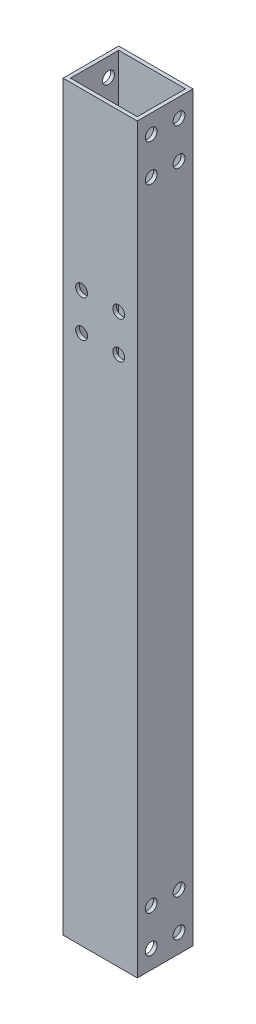
ISO-10303-21;
HEADER;
FILE_DESCRIPTION(('STEP AP214'),'2;1');
FILE_NAME('part.step','',(''),(''),'','','');
FILE_SCHEMA(('AUTOMOTIVE_DESIGN { 1 0 10303 214 1 1 1 1 }'));
ENDSEC;
DATA;
#1=APPLICATION_CONTEXT('core data for automotive mechanical design processes');
#2=APPLICATION_PROTOCOL_DEFINITION('international standard','automotive_design',2000,#1);
#3=PRODUCT_CONTEXT('',#1,'mechanical');
#4=PRODUCT('Part','Part','',(#3));
#5=PRODUCT_RELATED_PRODUCT_CATEGORY('part','',(#4));
#6=PRODUCT_DEFINITION_FORMATION('','',#4);
#7=PRODUCT_DEFINITION_CONTEXT('part definition',#1,'design');
#8=PRODUCT_DEFINITION('design','',#6,#7);
#9=PRODUCT_DEFINITION_SHAPE('','',#8);
#10=(LENGTH_UNIT() NAMED_UNIT(*) SI_UNIT(.MILLI.,.METRE.));
#11=(NAMED_UNIT(*) PLANE_ANGLE_UNIT() SI_UNIT($,.RADIAN.));
#12=(NAMED_UNIT(*) SI_UNIT($,.STERADIAN.) SOLID_ANGLE_UNIT());
#13=UNCERTAINTY_MEASURE_WITH_UNIT(LENGTH_MEASURE(1.E-05),#10,'distance_accuracy_value','');
#14=(GEOMETRIC_REPRESENTATION_CONTEXT(3) GLOBAL_UNCERTAINTY_ASSIGNED_CONTEXT((#13)) GLOBAL_UNIT_ASSIGNED_CONTEXT((#10,
#11,#12)) REPRESENTATION_CONTEXT('',''));
#15=CARTESIAN_POINT('',(0.,0.,0.));
#16=DIRECTION('',(0.,0.,1.));
#17=DIRECTION('',(1.,0.,0.));
#18=AXIS2_PLACEMENT_3D('',#15,#16,#17);
#19=CARTESIAN_POINT('',(0.,200.,0.));
#20=DIRECTION('',(0.,1.,0.));
#21=DIRECTION('',(0.,0.,1.));
#22=AXIS2_PLACEMENT_3D('',#19,#20,#21);
#23=PLANE('',#22);
#24=DIRECTION('',(0.,0.,-1.));
#25=VECTOR('',#24,1.);
#26=CARTESIAN_POINT('',(10.,200.,7.5));
#27=LINE('',#26,#25);
#28=CARTESIAN_POINT('',(10.,200.,7.5));
#29=VERTEX_POINT('',#28);
#30=CARTESIAN_POINT('',(10.,200.,-7.5));
#31=VERTEX_POINT('',#30);
#32=EDGE_CURVE('E185',#29,#31,#27,.T.);
#33=ORIENTED_EDGE('',*,*,#32,.T.);
#34=DIRECTION('',(-1.,0.,0.));
#35=VECTOR('',#34,1.);
#36=CARTESIAN_POINT('',(-10.,200.,-7.5));
#37=LINE('',#36,#35);
#38=CARTESIAN_POINT('',(-10.,200.,-7.5));
#39=VERTEX_POINT('',#38);
#40=EDGE_CURVE('E189',#31,#39,#37,.T.);
#41=ORIENTED_EDGE('',*,*,#40,.T.);
#42=DIRECTION('',(0.,0.,1.));
#43=VECTOR('',#42,1.);
#44=CARTESIAN_POINT('',(-10.,200.,7.5));
#45=LINE('',#44,#43);
#46=CARTESIAN_POINT('',(-10.,200.,7.5));
#47=VERTEX_POINT('',#46);
#48=EDGE_CURVE('E193',#39,#47,#45,.T.);
#49=ORIENTED_EDGE('',*,*,#48,.T.);
#50=DIRECTION('',(1.,0.,0.));
#51=VECTOR('',#50,1.);
#52=CARTESIAN_POINT('',(-10.,200.,7.5));
#53=LINE('',#52,#51);
#54=EDGE_CURVE('E196',#47,#29,#53,.T.);
#55=ORIENTED_EDGE('',*,*,#54,.T.);
#56=EDGE_LOOP('',(#33,#41,#49,#55));
#57=FACE_BOUND('',#56,.T.);
#58=DIRECTION('',(-1.,0.,0.));
#59=VECTOR('',#58,1.);
#60=CARTESIAN_POINT('',(0.,200.,-6.5));
#61=LINE('',#60,#59);
#62=CARTESIAN_POINT('',(9.,200.,-6.5));
#63=VERTEX_POINT('',#62);
#64=CARTESIAN_POINT('',(-9.,200.,-6.5));
#65=VERTEX_POINT('',#64);
#66=EDGE_CURVE('E144',#63,#65,#61,.T.);
#67=ORIENTED_EDGE('',*,*,#66,.F.);
#68=DIRECTION('',(0.,0.,-1.));
#69=VECTOR('',#68,1.);
#70=CARTESIAN_POINT('',(9.,200.,0.));
#71=LINE('',#70,#69);
#72=CARTESIAN_POINT('',(9.,200.,6.5));
#73=VERTEX_POINT('',#72);
#74=EDGE_CURVE('E135',#73,#63,#71,.T.);
#75=ORIENTED_EDGE('',*,*,#74,.F.);
#76=DIRECTION('',(1.,0.,0.));
#77=VECTOR('',#76,1.);
#78=CARTESIAN_POINT('',(0.,200.,6.5));
#79=LINE('',#78,#77);
#80=CARTESIAN_POINT('',(-9.,200.,6.5));
#81=VERTEX_POINT('',#80);
#82=EDGE_CURVE('E161',#81,#73,#79,.T.);
#83=ORIENTED_EDGE('',*,*,#82,.F.);
#84=DIRECTION('',(0.,0.,1.));
#85=VECTOR('',#84,1.);
#86=CARTESIAN_POINT('',(-9.,200.,0.));
#87=LINE('',#86,#85);
#88=EDGE_CURVE('E157',#65,#81,#87,.T.);
#89=ORIENTED_EDGE('',*,*,#88,.F.);
#90=EDGE_LOOP('',(#67,#75,#83,#89));
#91=FACE_BOUND('',#90,.T.);
#92=ADVANCED_FACE('F67',(#57,#91),#23,.T.);
#93=CARTESIAN_POINT('',(0.,0.,0.));
#94=DIRECTION('',(0.,1.,0.));
#95=DIRECTION('',(0.,0.,1.));
#96=AXIS2_PLACEMENT_3D('',#93,#94,#95);
#97=PLANE('',#96);
#98=DIRECTION('',(0.,0.,-1.));
#99=VECTOR('',#98,1.);
#100=CARTESIAN_POINT('',(10.,0.,7.5));
#101=LINE('',#100,#99);
#102=CARTESIAN_POINT('',(10.,0.,7.5));
#103=VERTEX_POINT('',#102);
#104=CARTESIAN_POINT('',(10.,0.,-7.5));
#105=VERTEX_POINT('',#104);
#106=EDGE_CURVE('E153',#103,#105,#101,.T.);
#107=ORIENTED_EDGE('',*,*,#106,.F.);
#108=DIRECTION('',(1.,0.,0.));
#109=VECTOR('',#108,1.);
#110=CARTESIAN_POINT('',(-10.,0.,7.5));
#111=LINE('',#110,#109);
#112=CARTESIAN_POINT('',(-10.,0.,7.5));
#113=VERTEX_POINT('',#112);
#114=EDGE_CURVE('E190',#113,#103,#111,.T.);
#115=ORIENTED_EDGE('',*,*,#114,.F.);
#116=DIRECTION('',(0.,0.,1.));
#117=VECTOR('',#116,1.);
#118=CARTESIAN_POINT('',(-10.,0.,7.5));
#119=LINE('',#118,#117);
#120=CARTESIAN_POINT('',(-10.,0.,-7.5));
#121=VERTEX_POINT('',#120);
#122=EDGE_CURVE('E206',#121,#113,#119,.T.);
#123=ORIENTED_EDGE('',*,*,#122,.F.);
#124=DIRECTION('',(-1.,0.,0.));
#125=VECTOR('',#124,1.);
#126=CARTESIAN_POINT('',(-10.,0.,-7.5));
#127=LINE('',#126,#125);
#128=EDGE_CURVE('E203',#105,#121,#127,.T.);
#129=ORIENTED_EDGE('',*,*,#128,.F.);
#130=EDGE_LOOP('',(#107,#115,#123,#129));
#131=FACE_BOUND('',#130,.T.);
#132=DIRECTION('',(0.,0.,-1.));
#133=VECTOR('',#132,1.);
#134=CARTESIAN_POINT('',(9.,0.,0.));
#135=LINE('',#134,#133);
#136=CARTESIAN_POINT('',(9.,0.,6.5));
#137=VERTEX_POINT('',#136);
#138=CARTESIAN_POINT('',(9.,0.,-6.5));
#139=VERTEX_POINT('',#138);
#140=EDGE_CURVE('E93',#137,#139,#135,.T.);
#141=ORIENTED_EDGE('',*,*,#140,.T.);
#142=DIRECTION('',(-1.,0.,0.));
#143=VECTOR('',#142,1.);
#144=CARTESIAN_POINT('',(0.,0.,-6.5));
#145=LINE('',#144,#143);
#146=CARTESIAN_POINT('',(-9.,0.,-6.5));
#147=VERTEX_POINT('',#146);
#148=EDGE_CURVE('E151',#139,#147,#145,.T.);
#149=ORIENTED_EDGE('',*,*,#148,.T.);
#150=DIRECTION('',(0.,0.,1.));
#151=VECTOR('',#150,1.);
#152=CARTESIAN_POINT('',(-9.,0.,0.));
#153=LINE('',#152,#151);
#154=CARTESIAN_POINT('',(-9.,0.,6.5));
#155=VERTEX_POINT('',#154);
#156=EDGE_CURVE('E172',#147,#155,#153,.T.);
#157=ORIENTED_EDGE('',*,*,#156,.T.);
#158=DIRECTION('',(1.,0.,0.));
#159=VECTOR('',#158,1.);
#160=CARTESIAN_POINT('',(0.,0.,6.5));
#161=LINE('',#160,#159);
#162=EDGE_CURVE('E145',#155,#137,#161,.T.);
#163=ORIENTED_EDGE('',*,*,#162,.T.);
#164=EDGE_LOOP('',(#141,#149,#157,#163));
#165=FACE_BOUND('',#164,.T.);
#166=ADVANCED_FACE('F371',(#131,#165),#97,.F.);
#167=CARTESIAN_POINT('',(10.,200.,7.5));
#168=DIRECTION('',(-1.,0.,0.));
#169=DIRECTION('',(0.,0.,1.));
#170=AXIS2_PLACEMENT_3D('',#167,#168,#169);
#171=PLANE('',#170);
#172=CARTESIAN_POINT('',(10.,185.,-3.74999999999998));
#173=DIRECTION('',(1.,0.,0.));
#174=DIRECTION('',(0.,0.,1.));
#175=AXIS2_PLACEMENT_3D('',#172,#173,#174);
#176=CIRCLE('',#175,1.59999999999999);
#177=CARTESIAN_POINT('',(10.,185.,-2.14999999999999));
#178=VERTEX_POINT('',#177);
#179=EDGE_CURVE('E476',#178,#178,#176,.T.);
#180=ORIENTED_EDGE('',*,*,#179,.F.);
#181=EDGE_LOOP('',(#180));
#182=FACE_BOUND('',#181,.T.);
#183=CARTESIAN_POINT('',(10.,15.,-3.75));
#184=DIRECTION('',(1.,0.,0.));
#185=DIRECTION('',(0.,0.,-1.));
#186=AXIS2_PLACEMENT_3D('',#183,#184,#185);
#187=CIRCLE('',#186,1.6);
#188=CARTESIAN_POINT('',(10.,15.,-5.35));
#189=VERTEX_POINT('',#188);
#190=EDGE_CURVE('E480',#189,#189,#187,.T.);
#191=ORIENTED_EDGE('',*,*,#190,.F.);
#192=EDGE_LOOP('',(#191));
#193=FACE_BOUND('',#192,.T.);
#194=CARTESIAN_POINT('',(10.,5.,-3.75));
#195=DIRECTION('',(1.,0.,0.));
#196=DIRECTION('',(0.,0.,1.));
#197=AXIS2_PLACEMENT_3D('',#194,#195,#196);
#198=CIRCLE('',#197,1.6);
#199=CARTESIAN_POINT('',(10.,5.,-2.15));
#200=VERTEX_POINT('',#199);
#201=EDGE_CURVE('E484',#200,#200,#198,.T.);
#202=ORIENTED_EDGE('',*,*,#201,.F.);
#203=EDGE_LOOP('',(#202));
#204=FACE_BOUND('',#203,.T.);
#205=CARTESIAN_POINT('',(10.,15.,3.75));
#206=DIRECTION('',(1.,0.,0.));
#207=DIRECTION('',(0.,0.,1.));
#208=AXIS2_PLACEMENT_3D('',#205,#206,#207);
#209=CIRCLE('',#208,1.6);
#210=CARTESIAN_POINT('',(10.,15.,5.35));
#211=VERTEX_POINT('',#210);
#212=EDGE_CURVE('E431',#211,#211,#209,.T.);
#213=ORIENTED_EDGE('',*,*,#212,.F.);
#214=EDGE_LOOP('',(#213));
#215=FACE_BOUND('',#214,.T.);
#216=CARTESIAN_POINT('',(10.,195.,3.75000000000002));
#217=DIRECTION('',(1.,0.,0.));
#218=DIRECTION('',(0.,0.,1.));
#219=AXIS2_PLACEMENT_3D('',#216,#217,#218);
#220=CIRCLE('',#219,1.59999999999999);
#221=CARTESIAN_POINT('',(10.,195.,5.35000000000002));
#222=VERTEX_POINT('',#221);
#223=EDGE_CURVE('E491',#222,#222,#220,.T.);
#224=ORIENTED_EDGE('',*,*,#223,.F.);
#225=EDGE_LOOP('',(#224));
#226=FACE_BOUND('',#225,.T.);
#227=CARTESIAN_POINT('',(10.,185.,3.75000000000002));
#228=DIRECTION('',(1.,0.,0.));
#229=DIRECTION('',(0.,0.,-1.));
#230=AXIS2_PLACEMENT_3D('',#227,#228,#229);
#231=CIRCLE('',#230,1.59999999999999);
#232=CARTESIAN_POINT('',(10.,185.,2.15000000000003));
#233=VERTEX_POINT('',#232);
#234=EDGE_CURVE('E495',#233,#233,#231,.T.);
#235=ORIENTED_EDGE('',*,*,#234,.F.);
#236=EDGE_LOOP('',(#235));
#237=FACE_BOUND('',#236,.T.);
#238=CARTESIAN_POINT('',(10.,195.,-3.74999999999998));
#239=DIRECTION('',(1.,0.,0.));
#240=DIRECTION('',(0.,0.,-1.));
#241=AXIS2_PLACEMENT_3D('',#238,#239,#240);
#242=CIRCLE('',#241,1.6);
#243=CARTESIAN_POINT('',(10.,195.,-5.34999999999997));
#244=VERTEX_POINT('',#243);
#245=EDGE_CURVE('E498',#244,#244,#242,.T.);
#246=ORIENTED_EDGE('',*,*,#245,.F.);
#247=EDGE_LOOP('',(#246));
#248=FACE_BOUND('',#247,.T.);
#249=CARTESIAN_POINT('',(10.,5.,3.75));
#250=DIRECTION('',(1.,0.,0.));
#251=DIRECTION('',(0.,0.,-1.));
#252=AXIS2_PLACEMENT_3D('',#249,#250,#251);
#253=CIRCLE('',#252,1.6);
#254=CARTESIAN_POINT('',(10.,5.,2.15));
#255=VERTEX_POINT('',#254);
#256=EDGE_CURVE('E427',#255,#255,#253,.T.);
#257=ORIENTED_EDGE('',*,*,#256,.F.);
#258=EDGE_LOOP('',(#257));
#259=FACE_BOUND('',#258,.T.);
#260=ORIENTED_EDGE('',*,*,#106,.T.);
#261=DIRECTION('',(0.,-1.,0.));
#262=VECTOR('',#261,1.);
#263=CARTESIAN_POINT('',(10.,200.,-7.5));
#264=LINE('',#263,#262);
#265=EDGE_CURVE('E12',#31,#105,#264,.T.);
#266=ORIENTED_EDGE('',*,*,#265,.F.);
#267=ORIENTED_EDGE('',*,*,#32,.F.);
#268=DIRECTION('',(0.,-1.,0.));
#269=VECTOR('',#268,1.);
#270=CARTESIAN_POINT('',(10.,200.,7.5));
#271=LINE('',#270,#269);
#272=EDGE_CURVE('E199',#29,#103,#271,.T.);
#273=ORIENTED_EDGE('',*,*,#272,.T.);
#274=EDGE_LOOP('',(#260,#266,#267,#273));
#275=FACE_BOUND('',#274,.T.);
#276=ADVANCED_FACE('F69',(#182,#193,#204,#215,#226,#237,#248,#259,#275),#171,.F.);
#277=CARTESIAN_POINT('',(-10.,200.,-7.5));
#278=DIRECTION('',(0.,0.,1.));
#279=DIRECTION('',(1.,0.,0.));
#280=AXIS2_PLACEMENT_3D('',#277,#278,#279);
#281=PLANE('',#280);
#282=CARTESIAN_POINT('',(5.,153.,-7.5));
#283=DIRECTION('',(0.,0.,1.));
#284=DIRECTION('',(-1.,0.,0.));
#285=AXIS2_PLACEMENT_3D('',#282,#283,#284);
#286=CIRCLE('',#285,1.59999999999998);
#287=CARTESIAN_POINT('',(3.40000000000002,153.,-7.5));
#288=VERTEX_POINT('',#287);
#289=EDGE_CURVE('E292',#288,#288,#286,.T.);
#290=ORIENTED_EDGE('',*,*,#289,.T.);
#291=EDGE_LOOP('',(#290));
#292=FACE_BOUND('',#291,.T.);
#293=CARTESIAN_POINT('',(5.,143.,-7.5));
#294=DIRECTION('',(0.,0.,1.));
#295=DIRECTION('',(1.,0.,0.));
#296=AXIS2_PLACEMENT_3D('',#293,#294,#295);
#297=CIRCLE('',#296,1.59999999999998);
#298=CARTESIAN_POINT('',(6.59999999999998,143.,-7.5));
#299=VERTEX_POINT('',#298);
#300=EDGE_CURVE('E306',#299,#299,#297,.T.);
#301=ORIENTED_EDGE('',*,*,#300,.T.);
#302=EDGE_LOOP('',(#301));
#303=FACE_BOUND('',#302,.T.);
#304=CARTESIAN_POINT('',(-5.,143.,-7.5));
#305=DIRECTION('',(0.,0.,1.));
#306=DIRECTION('',(-1.,0.,0.));
#307=AXIS2_PLACEMENT_3D('',#304,#305,#306);
#308=CIRCLE('',#307,1.59999999999998);
#309=CARTESIAN_POINT('',(-6.59999999999998,143.,-7.5));
#310=VERTEX_POINT('',#309);
#311=EDGE_CURVE('E298',#310,#310,#308,.T.);
#312=ORIENTED_EDGE('',*,*,#311,.T.);
#313=EDGE_LOOP('',(#312));
#314=FACE_BOUND('',#313,.T.);
#315=CARTESIAN_POINT('',(-5.,153.,-7.5));
#316=DIRECTION('',(0.,0.,1.));
#317=DIRECTION('',(1.,0.,0.));
#318=AXIS2_PLACEMENT_3D('',#315,#316,#317);
#319=CIRCLE('',#318,1.59999999999998);
#320=CARTESIAN_POINT('',(-3.40000000000002,153.,-7.5));
#321=VERTEX_POINT('',#320);
#322=EDGE_CURVE('E226',#321,#321,#319,.T.);
#323=ORIENTED_EDGE('',*,*,#322,.T.);
#324=EDGE_LOOP('',(#323));
#325=FACE_BOUND('',#324,.T.);
#326=ORIENTED_EDGE('',*,*,#128,.T.);
#327=DIRECTION('',(0.,-1.,0.));
#328=VECTOR('',#327,1.);
#329=CARTESIAN_POINT('',(-10.,200.,-7.5));
#330=LINE('',#329,#328);
#331=EDGE_CURVE('E77',#39,#121,#330,.T.);
#332=ORIENTED_EDGE('',*,*,#331,.F.);
#333=ORIENTED_EDGE('',*,*,#40,.F.);
#334=ORIENTED_EDGE('',*,*,#265,.T.);
#335=EDGE_LOOP('',(#326,#332,#333,#334));
#336=FACE_BOUND('',#335,.T.);
#337=ADVANCED_FACE('F357',(#292,#303,#314,#325,#336),#281,.F.);
#338=CARTESIAN_POINT('',(-10.,200.,7.5));
#339=DIRECTION('',(1.,0.,0.));
#340=DIRECTION('',(0.,0.,-1.));
#341=AXIS2_PLACEMENT_3D('',#338,#339,#340);
#342=PLANE('',#341);
#343=CARTESIAN_POINT('',(-10.,185.,-3.74999999999998));
#344=DIRECTION('',(1.,0.,0.));
#345=DIRECTION('',(0.,0.,1.));
#346=AXIS2_PLACEMENT_3D('',#343,#344,#345);
#347=CIRCLE('',#346,1.59999999999999);
#348=CARTESIAN_POINT('',(-10.,185.,-2.14999999999999));
#349=VERTEX_POINT('',#348);
#350=EDGE_CURVE('E398',#349,#349,#347,.T.);
#351=ORIENTED_EDGE('',*,*,#350,.T.);
#352=EDGE_LOOP('',(#351));
#353=FACE_BOUND('',#352,.T.);
#354=CARTESIAN_POINT('',(-10.,15.,-3.75));
#355=DIRECTION('',(1.,0.,0.));
#356=DIRECTION('',(0.,0.,-1.));
#357=AXIS2_PLACEMENT_3D('',#354,#355,#356);
#358=CIRCLE('',#357,1.6);
#359=CARTESIAN_POINT('',(-10.,15.,-5.35));
#360=VERTEX_POINT('',#359);
#361=EDGE_CURVE('E402',#360,#360,#358,.T.);
#362=ORIENTED_EDGE('',*,*,#361,.T.);
#363=EDGE_LOOP('',(#362));
#364=FACE_BOUND('',#363,.T.);
#365=CARTESIAN_POINT('',(-10.,5.,-3.75));
#366=DIRECTION('',(1.,0.,0.));
#367=DIRECTION('',(0.,0.,1.));
#368=AXIS2_PLACEMENT_3D('',#365,#366,#367);
#369=CIRCLE('',#368,1.6);
#370=CARTESIAN_POINT('',(-10.,5.,-2.15));
#371=VERTEX_POINT('',#370);
#372=EDGE_CURVE('E406',#371,#371,#369,.T.);
#373=ORIENTED_EDGE('',*,*,#372,.T.);
#374=EDGE_LOOP('',(#373));
#375=FACE_BOUND('',#374,.T.);
#376=CARTESIAN_POINT('',(-10.,15.,3.75));
#377=DIRECTION('',(1.,0.,0.));
#378=DIRECTION('',(0.,0.,1.));
#379=AXIS2_PLACEMENT_3D('',#376,#377,#378);
#380=CIRCLE('',#379,1.6);
#381=CARTESIAN_POINT('',(-10.,15.,5.35));
#382=VERTEX_POINT('',#381);
#383=EDGE_CURVE('E410',#382,#382,#380,.T.);
#384=ORIENTED_EDGE('',*,*,#383,.T.);
#385=EDGE_LOOP('',(#384));
#386=FACE_BOUND('',#385,.T.);
#387=CARTESIAN_POINT('',(-10.,195.,3.75000000000002));
#388=DIRECTION('',(1.,0.,0.));
#389=DIRECTION('',(0.,0.,1.));
#390=AXIS2_PLACEMENT_3D('',#387,#388,#389);
#391=CIRCLE('',#390,1.59999999999999);
#392=CARTESIAN_POINT('',(-10.,195.,5.35000000000002));
#393=VERTEX_POINT('',#392);
#394=EDGE_CURVE('E414',#393,#393,#391,.T.);
#395=ORIENTED_EDGE('',*,*,#394,.T.);
#396=EDGE_LOOP('',(#395));
#397=FACE_BOUND('',#396,.T.);
#398=CARTESIAN_POINT('',(-10.,185.,3.75000000000002));
#399=DIRECTION('',(1.,0.,0.));
#400=DIRECTION('',(0.,0.,-1.));
#401=AXIS2_PLACEMENT_3D('',#398,#399,#400);
#402=CIRCLE('',#401,1.59999999999999);
#403=CARTESIAN_POINT('',(-10.,185.,2.15000000000003));
#404=VERTEX_POINT('',#403);
#405=EDGE_CURVE('E418',#404,#404,#402,.T.);
#406=ORIENTED_EDGE('',*,*,#405,.T.);
#407=EDGE_LOOP('',(#406));
#408=FACE_BOUND('',#407,.T.);
#409=CARTESIAN_POINT('',(-10.,195.,-3.74999999999998));
#410=DIRECTION('',(1.,0.,0.));
#411=DIRECTION('',(0.,0.,-1.));
#412=AXIS2_PLACEMENT_3D('',#409,#410,#411);
#413=CIRCLE('',#412,1.6);
#414=CARTESIAN_POINT('',(-10.,195.,-5.34999999999997));
#415=VERTEX_POINT('',#414);
#416=EDGE_CURVE('E422',#415,#415,#413,.T.);
#417=ORIENTED_EDGE('',*,*,#416,.T.);
#418=EDGE_LOOP('',(#417));
#419=FACE_BOUND('',#418,.T.);
#420=CARTESIAN_POINT('',(-10.,5.,3.75));
#421=DIRECTION('',(1.,0.,0.));
#422=DIRECTION('',(0.,0.,-1.));
#423=AXIS2_PLACEMENT_3D('',#420,#421,#422);
#424=CIRCLE('',#423,1.6);
#425=CARTESIAN_POINT('',(-10.,5.,2.15));
#426=VERTEX_POINT('',#425);
#427=EDGE_CURVE('E246',#426,#426,#424,.T.);
#428=ORIENTED_EDGE('',*,*,#427,.T.);
#429=EDGE_LOOP('',(#428));
#430=FACE_BOUND('',#429,.T.);
#431=ORIENTED_EDGE('',*,*,#122,.T.);
#432=DIRECTION('',(0.,-1.,0.));
#433=VECTOR('',#432,1.);
#434=CARTESIAN_POINT('',(-10.,200.,7.5));
#435=LINE('',#434,#433);
#436=EDGE_CURVE('E214',#47,#113,#435,.T.);
#437=ORIENTED_EDGE('',*,*,#436,.F.);
#438=ORIENTED_EDGE('',*,*,#48,.F.);
#439=ORIENTED_EDGE('',*,*,#331,.T.);
#440=EDGE_LOOP('',(#431,#437,#438,#439));
#441=FACE_BOUND('',#440,.T.);
#442=ADVANCED_FACE('F360',(#353,#364,#375,#386,#397,#408,#419,#430,#441),#342,.F.);
#443=CARTESIAN_POINT('',(-10.,200.,7.5));
#444=DIRECTION('',(0.,0.,-1.));
#445=DIRECTION('',(-1.,0.,0.));
#446=AXIS2_PLACEMENT_3D('',#443,#444,#445);
#447=PLANE('',#446);
#448=CARTESIAN_POINT('',(5.,153.,7.5));
#449=DIRECTION('',(0.,0.,1.));
#450=DIRECTION('',(-1.,0.,0.));
#451=AXIS2_PLACEMENT_3D('',#448,#449,#450);
#452=CIRCLE('',#451,1.59999999999998);
#453=CARTESIAN_POINT('',(3.40000000000002,153.,7.5));
#454=VERTEX_POINT('',#453);
#455=EDGE_CURVE('E310',#454,#454,#452,.T.);
#456=ORIENTED_EDGE('',*,*,#455,.F.);
#457=EDGE_LOOP('',(#456));
#458=FACE_BOUND('',#457,.T.);
#459=CARTESIAN_POINT('',(5.,143.,7.5));
#460=DIRECTION('',(0.,0.,1.));
#461=DIRECTION('',(1.,0.,0.));
#462=AXIS2_PLACEMENT_3D('',#459,#460,#461);
#463=CIRCLE('',#462,1.59999999999998);
#464=CARTESIAN_POINT('',(6.59999999999998,143.,7.5));
#465=VERTEX_POINT('',#464);
#466=EDGE_CURVE('E302',#465,#465,#463,.T.);
#467=ORIENTED_EDGE('',*,*,#466,.F.);
#468=EDGE_LOOP('',(#467));
#469=FACE_BOUND('',#468,.T.);
#470=CARTESIAN_POINT('',(-5.,143.,7.5));
#471=DIRECTION('',(0.,0.,1.));
#472=DIRECTION('',(-1.,0.,0.));
#473=AXIS2_PLACEMENT_3D('',#470,#471,#472);
#474=CIRCLE('',#473,1.59999999999998);
#475=CARTESIAN_POINT('',(-6.59999999999998,143.,7.5));
#476=VERTEX_POINT('',#475);
#477=EDGE_CURVE('E293',#476,#476,#474,.T.);
#478=ORIENTED_EDGE('',*,*,#477,.F.);
#479=EDGE_LOOP('',(#478));
#480=FACE_BOUND('',#479,.T.);
#481=CARTESIAN_POINT('',(-5.,153.,7.5));
#482=DIRECTION('',(0.,0.,1.));
#483=DIRECTION('',(1.,0.,0.));
#484=AXIS2_PLACEMENT_3D('',#481,#482,#483);
#485=CIRCLE('',#484,1.59999999999998);
#486=CARTESIAN_POINT('',(-3.40000000000002,153.,7.5));
#487=VERTEX_POINT('',#486);
#488=EDGE_CURVE('E297',#487,#487,#485,.T.);
#489=ORIENTED_EDGE('',*,*,#488,.F.);
#490=EDGE_LOOP('',(#489));
#491=FACE_BOUND('',#490,.T.);
#492=ORIENTED_EDGE('',*,*,#114,.T.);
#493=ORIENTED_EDGE('',*,*,#272,.F.);
#494=ORIENTED_EDGE('',*,*,#54,.F.);
#495=ORIENTED_EDGE('',*,*,#436,.T.);
#496=EDGE_LOOP('',(#492,#493,#494,#495));
#497=FACE_BOUND('',#496,.T.);
#498=ADVANCED_FACE('F375',(#458,#469,#480,#491,#497),#447,.F.);
#499=CARTESIAN_POINT('',(9.,200.,0.));
#500=DIRECTION('',(-1.,0.,0.));
#501=DIRECTION('',(0.,0.,1.));
#502=AXIS2_PLACEMENT_3D('',#499,#500,#501);
#503=PLANE('',#502);
#504=CARTESIAN_POINT('',(9.,185.,-3.74999999999998));
#505=DIRECTION('',(-1.,0.,0.));
#506=DIRECTION('',(0.,0.,1.));
#507=AXIS2_PLACEMENT_3D('',#504,#505,#506);
#508=CIRCLE('',#507,1.59999999999999);
#509=CARTESIAN_POINT('',(9.,185.,-2.14999999999999));
#510=VERTEX_POINT('',#509);
#511=EDGE_CURVE('E288',#510,#510,#508,.T.);
#512=ORIENTED_EDGE('',*,*,#511,.F.);
#513=EDGE_LOOP('',(#512));
#514=FACE_BOUND('',#513,.T.);
#515=CARTESIAN_POINT('',(9.,15.,-3.75));
#516=DIRECTION('',(-1.,0.,0.));
#517=DIRECTION('',(0.,0.,1.));
#518=AXIS2_PLACEMENT_3D('',#515,#516,#517);
#519=CIRCLE('',#518,1.6);
#520=CARTESIAN_POINT('',(9.,15.,-2.15));
#521=VERTEX_POINT('',#520);
#522=EDGE_CURVE('E274',#521,#521,#519,.T.);
#523=ORIENTED_EDGE('',*,*,#522,.F.);
#524=EDGE_LOOP('',(#523));
#525=FACE_BOUND('',#524,.T.);
#526=CARTESIAN_POINT('',(9.,5.,-3.75));
#527=DIRECTION('',(-1.,0.,0.));
#528=DIRECTION('',(0.,0.,1.));
#529=AXIS2_PLACEMENT_3D('',#526,#527,#528);
#530=CIRCLE('',#529,1.6);
#531=CARTESIAN_POINT('',(9.,5.,-2.15));
#532=VERTEX_POINT('',#531);
#533=EDGE_CURVE('E270',#532,#532,#530,.T.);
#534=ORIENTED_EDGE('',*,*,#533,.F.);
#535=EDGE_LOOP('',(#534));
#536=FACE_BOUND('',#535,.T.);
#537=CARTESIAN_POINT('',(9.,15.,3.75));
#538=DIRECTION('',(-1.,0.,0.));
#539=DIRECTION('',(0.,0.,1.));
#540=AXIS2_PLACEMENT_3D('',#537,#538,#539);
#541=CIRCLE('',#540,1.6);
#542=CARTESIAN_POINT('',(9.,15.,5.35));
#543=VERTEX_POINT('',#542);
#544=EDGE_CURVE('E266',#543,#543,#541,.T.);
#545=ORIENTED_EDGE('',*,*,#544,.F.);
#546=EDGE_LOOP('',(#545));
#547=FACE_BOUND('',#546,.T.);
#548=CARTESIAN_POINT('',(9.,195.,3.75000000000002));
#549=DIRECTION('',(-1.,0.,0.));
#550=DIRECTION('',(0.,0.,1.));
#551=AXIS2_PLACEMENT_3D('',#548,#549,#550);
#552=CIRCLE('',#551,1.59999999999999);
#553=CARTESIAN_POINT('',(9.,195.,5.35000000000002));
#554=VERTEX_POINT('',#553);
#555=EDGE_CURVE('E261',#554,#554,#552,.T.);
#556=ORIENTED_EDGE('',*,*,#555,.F.);
#557=EDGE_LOOP('',(#556));
#558=FACE_BOUND('',#557,.T.);
#559=CARTESIAN_POINT('',(9.,185.,3.75000000000002));
#560=DIRECTION('',(-1.,0.,0.));
#561=DIRECTION('',(0.,0.,1.));
#562=AXIS2_PLACEMENT_3D('',#559,#560,#561);
#563=CIRCLE('',#562,1.59999999999999);
#564=CARTESIAN_POINT('',(9.,185.,5.35000000000001));
#565=VERTEX_POINT('',#564);
#566=EDGE_CURVE('E256',#565,#565,#563,.T.);
#567=ORIENTED_EDGE('',*,*,#566,.F.);
#568=EDGE_LOOP('',(#567));
#569=FACE_BOUND('',#568,.T.);
#570=CARTESIAN_POINT('',(9.,195.,-3.74999999999998));
#571=DIRECTION('',(-1.,0.,0.));
#572=DIRECTION('',(0.,0.,1.));
#573=AXIS2_PLACEMENT_3D('',#570,#571,#572);
#574=CIRCLE('',#573,1.6);
#575=CARTESIAN_POINT('',(9.,195.,-2.14999999999998));
#576=VERTEX_POINT('',#575);
#577=EDGE_CURVE('E251',#576,#576,#574,.T.);
#578=ORIENTED_EDGE('',*,*,#577,.F.);
#579=EDGE_LOOP('',(#578));
#580=FACE_BOUND('',#579,.T.);
#581=CARTESIAN_POINT('',(9.,5.,3.75));
#582=DIRECTION('',(-1.,0.,0.));
#583=DIRECTION('',(0.,0.,1.));
#584=AXIS2_PLACEMENT_3D('',#581,#582,#583);
#585=CIRCLE('',#584,1.6);
#586=CARTESIAN_POINT('',(9.,5.,5.35));
#587=VERTEX_POINT('',#586);
#588=EDGE_CURVE('E245',#587,#587,#585,.T.);
#589=ORIENTED_EDGE('',*,*,#588,.F.);
#590=EDGE_LOOP('',(#589));
#591=FACE_BOUND('',#590,.T.);
#592=ORIENTED_EDGE('',*,*,#140,.F.);
#593=DIRECTION('',(0.,-1.,0.));
#594=VECTOR('',#593,1.);
#595=CARTESIAN_POINT('',(9.,200.,6.5));
#596=LINE('',#595,#594);
#597=EDGE_CURVE('E139',#73,#137,#596,.T.);
#598=ORIENTED_EDGE('',*,*,#597,.F.);
#599=ORIENTED_EDGE('',*,*,#74,.T.);
#600=DIRECTION('',(0.,-1.,0.));
#601=VECTOR('',#600,1.);
#602=CARTESIAN_POINT('',(9.,200.,-6.5));
#603=LINE('',#602,#601);
#604=EDGE_CURVE('E138',#63,#139,#603,.T.);
#605=ORIENTED_EDGE('',*,*,#604,.T.);
#606=EDGE_LOOP('',(#592,#598,#599,#605));
#607=FACE_BOUND('',#606,.T.);
#608=ADVANCED_FACE('F137',(#514,#525,#536,#547,#558,#569,#580,#591,#607),#503,.T.);
#609=CARTESIAN_POINT('',(0.,200.,-6.5));
#610=DIRECTION('',(0.,0.,1.));
#611=DIRECTION('',(1.,0.,0.));
#612=AXIS2_PLACEMENT_3D('',#609,#610,#611);
#613=PLANE('',#612);
#614=CARTESIAN_POINT('',(5.,153.,-6.5));
#615=DIRECTION('',(0.,0.,1.));
#616=DIRECTION('',(1.,0.,0.));
#617=AXIS2_PLACEMENT_3D('',#614,#615,#616);
#618=CIRCLE('',#617,1.59999999999998);
#619=CARTESIAN_POINT('',(6.59999999999998,153.,-6.5));
#620=VERTEX_POINT('',#619);
#621=EDGE_CURVE('E169',#620,#620,#618,.T.);
#622=ORIENTED_EDGE('',*,*,#621,.F.);
#623=EDGE_LOOP('',(#622));
#624=FACE_BOUND('',#623,.T.);
#625=CARTESIAN_POINT('',(5.,143.,-6.5));
#626=DIRECTION('',(0.,0.,1.));
#627=DIRECTION('',(1.,0.,0.));
#628=AXIS2_PLACEMENT_3D('',#625,#626,#627);
#629=CIRCLE('',#628,1.59999999999998);
#630=CARTESIAN_POINT('',(6.59999999999998,143.,-6.5));
#631=VERTEX_POINT('',#630);
#632=EDGE_CURVE('E236',#631,#631,#629,.T.);
#633=ORIENTED_EDGE('',*,*,#632,.F.);
#634=EDGE_LOOP('',(#633));
#635=FACE_BOUND('',#634,.T.);
#636=CARTESIAN_POINT('',(-5.,143.,-6.5));
#637=DIRECTION('',(0.,0.,1.));
#638=DIRECTION('',(1.,0.,0.));
#639=AXIS2_PLACEMENT_3D('',#636,#637,#638);
#640=CIRCLE('',#639,1.59999999999998);
#641=CARTESIAN_POINT('',(-3.40000000000002,143.,-6.5));
#642=VERTEX_POINT('',#641);
#643=EDGE_CURVE('E231',#642,#642,#640,.T.);
#644=ORIENTED_EDGE('',*,*,#643,.F.);
#645=EDGE_LOOP('',(#644));
#646=FACE_BOUND('',#645,.T.);
#647=CARTESIAN_POINT('',(-5.,153.,-6.5));
#648=DIRECTION('',(0.,0.,1.));
#649=DIRECTION('',(1.,0.,0.));
#650=AXIS2_PLACEMENT_3D('',#647,#648,#649);
#651=CIRCLE('',#650,1.59999999999998);
#652=CARTESIAN_POINT('',(-3.40000000000002,153.,-6.5));
#653=VERTEX_POINT('',#652);
#654=EDGE_CURVE('E225',#653,#653,#651,.T.);
#655=ORIENTED_EDGE('',*,*,#654,.F.);
#656=EDGE_LOOP('',(#655));
#657=FACE_BOUND('',#656,.T.);
#658=ORIENTED_EDGE('',*,*,#148,.F.);
#659=ORIENTED_EDGE('',*,*,#604,.F.);
#660=ORIENTED_EDGE('',*,*,#66,.T.);
#661=DIRECTION('',(0.,-1.,0.));
#662=VECTOR('',#661,1.);
#663=CARTESIAN_POINT('',(-9.,200.,-6.5));
#664=LINE('',#663,#662);
#665=EDGE_CURVE('E154',#65,#147,#664,.T.);
#666=ORIENTED_EDGE('',*,*,#665,.T.);
#667=EDGE_LOOP('',(#658,#659,#660,#666));
#668=FACE_BOUND('',#667,.T.);
#669=ADVANCED_FACE('F148',(#624,#635,#646,#657,#668),#613,.T.);
#670=CARTESIAN_POINT('',(-9.,200.,0.));
#671=DIRECTION('',(1.,0.,0.));
#672=DIRECTION('',(0.,0.,-1.));
#673=AXIS2_PLACEMENT_3D('',#670,#671,#672);
#674=PLANE('',#673);
#675=CARTESIAN_POINT('',(-9.,185.,-3.74999999999998));
#676=DIRECTION('',(1.,0.,0.));
#677=DIRECTION('',(0.,0.,-1.));
#678=AXIS2_PLACEMENT_3D('',#675,#676,#677);
#679=CIRCLE('',#678,1.59999999999999);
#680=CARTESIAN_POINT('',(-9.,185.,-5.34999999999997));
#681=VERTEX_POINT('',#680);
#682=EDGE_CURVE('E71',#681,#681,#679,.T.);
#683=ORIENTED_EDGE('',*,*,#682,.F.);
#684=EDGE_LOOP('',(#683));
#685=FACE_BOUND('',#684,.T.);
#686=CARTESIAN_POINT('',(-9.,15.,-3.75));
#687=DIRECTION('',(1.,0.,0.));
#688=DIRECTION('',(0.,0.,-1.));
#689=AXIS2_PLACEMENT_3D('',#686,#687,#688);
#690=CIRCLE('',#689,1.6);
#691=CARTESIAN_POINT('',(-9.,15.,-5.35));
#692=VERTEX_POINT('',#691);
#693=EDGE_CURVE('E271',#692,#692,#690,.T.);
#694=ORIENTED_EDGE('',*,*,#693,.F.);
#695=EDGE_LOOP('',(#694));
#696=FACE_BOUND('',#695,.T.);
#697=CARTESIAN_POINT('',(-9.,5.,-3.75));
#698=DIRECTION('',(1.,0.,0.));
#699=DIRECTION('',(0.,0.,-1.));
#700=AXIS2_PLACEMENT_3D('',#697,#698,#699);
#701=CIRCLE('',#700,1.6);
#702=CARTESIAN_POINT('',(-9.,5.,-5.35));
#703=VERTEX_POINT('',#702);
#704=EDGE_CURVE('E267',#703,#703,#701,.T.);
#705=ORIENTED_EDGE('',*,*,#704,.F.);
#706=EDGE_LOOP('',(#705));
#707=FACE_BOUND('',#706,.T.);
#708=CARTESIAN_POINT('',(-9.,15.,3.75));
#709=DIRECTION('',(1.,0.,0.));
#710=DIRECTION('',(0.,0.,-1.));
#711=AXIS2_PLACEMENT_3D('',#708,#709,#710);
#712=CIRCLE('',#711,1.6);
#713=CARTESIAN_POINT('',(-9.,15.,2.15));
#714=VERTEX_POINT('',#713);
#715=EDGE_CURVE('E262',#714,#714,#712,.T.);
#716=ORIENTED_EDGE('',*,*,#715,.F.);
#717=EDGE_LOOP('',(#716));
#718=FACE_BOUND('',#717,.T.);
#719=CARTESIAN_POINT('',(-9.,195.,3.75000000000002));
#720=DIRECTION('',(1.,0.,0.));
#721=DIRECTION('',(0.,0.,-1.));
#722=AXIS2_PLACEMENT_3D('',#719,#720,#721);
#723=CIRCLE('',#722,1.59999999999999);
#724=CARTESIAN_POINT('',(-9.,195.,2.15000000000003));
#725=VERTEX_POINT('',#724);
#726=EDGE_CURVE('E257',#725,#725,#723,.T.);
#727=ORIENTED_EDGE('',*,*,#726,.F.);
#728=EDGE_LOOP('',(#727));
#729=FACE_BOUND('',#728,.T.);
#730=CARTESIAN_POINT('',(-9.,185.,3.75000000000002));
#731=DIRECTION('',(1.,0.,0.));
#732=DIRECTION('',(0.,0.,-1.));
#733=AXIS2_PLACEMENT_3D('',#730,#731,#732);
#734=CIRCLE('',#733,1.59999999999999);
#735=CARTESIAN_POINT('',(-9.,185.,2.15000000000003));
#736=VERTEX_POINT('',#735);
#737=EDGE_CURVE('E252',#736,#736,#734,.T.);
#738=ORIENTED_EDGE('',*,*,#737,.F.);
#739=EDGE_LOOP('',(#738));
#740=FACE_BOUND('',#739,.T.);
#741=CARTESIAN_POINT('',(-9.,195.,-3.74999999999998));
#742=DIRECTION('',(1.,0.,0.));
#743=DIRECTION('',(0.,0.,-1.));
#744=AXIS2_PLACEMENT_3D('',#741,#742,#743);
#745=CIRCLE('',#744,1.6);
#746=CARTESIAN_POINT('',(-9.,195.,-5.34999999999997));
#747=VERTEX_POINT('',#746);
#748=EDGE_CURVE('E247',#747,#747,#745,.T.);
#749=ORIENTED_EDGE('',*,*,#748,.F.);
#750=EDGE_LOOP('',(#749));
#751=FACE_BOUND('',#750,.T.);
#752=CARTESIAN_POINT('',(-9.,5.,3.75));
#753=DIRECTION('',(1.,0.,0.));
#754=DIRECTION('',(0.,0.,-1.));
#755=AXIS2_PLACEMENT_3D('',#752,#753,#754);
#756=CIRCLE('',#755,1.6);
#757=CARTESIAN_POINT('',(-9.,5.,2.15));
#758=VERTEX_POINT('',#757);
#759=EDGE_CURVE('E241',#758,#758,#756,.T.);
#760=ORIENTED_EDGE('',*,*,#759,.F.);
#761=EDGE_LOOP('',(#760));
#762=FACE_BOUND('',#761,.T.);
#763=ORIENTED_EDGE('',*,*,#156,.F.);
#764=ORIENTED_EDGE('',*,*,#665,.F.);
#765=ORIENTED_EDGE('',*,*,#88,.T.);
#766=DIRECTION('',(0.,-1.,0.));
#767=VECTOR('',#766,1.);
#768=CARTESIAN_POINT('',(-9.,200.,6.5));
#769=LINE('',#768,#767);
#770=EDGE_CURVE('E85',#81,#155,#769,.T.);
#771=ORIENTED_EDGE('',*,*,#770,.T.);
#772=EDGE_LOOP('',(#763,#764,#765,#771));
#773=FACE_BOUND('',#772,.T.);
#774=ADVANCED_FACE('F340',(#685,#696,#707,#718,#729,#740,#751,#762,#773),#674,.T.);
#775=CARTESIAN_POINT('',(0.,200.,6.5));
#776=DIRECTION('',(0.,0.,-1.));
#777=DIRECTION('',(-1.,0.,0.));
#778=AXIS2_PLACEMENT_3D('',#775,#776,#777);
#779=PLANE('',#778);
#780=CARTESIAN_POINT('',(5.,153.,6.5));
#781=DIRECTION('',(0.,0.,-1.));
#782=DIRECTION('',(-1.,0.,0.));
#783=AXIS2_PLACEMENT_3D('',#780,#781,#782);
#784=CIRCLE('',#783,1.59999999999998);
#785=CARTESIAN_POINT('',(3.40000000000002,153.,6.5));
#786=VERTEX_POINT('',#785);
#787=EDGE_CURVE('E237',#786,#786,#784,.T.);
#788=ORIENTED_EDGE('',*,*,#787,.F.);
#789=EDGE_LOOP('',(#788));
#790=FACE_BOUND('',#789,.T.);
#791=CARTESIAN_POINT('',(5.,143.,6.5));
#792=DIRECTION('',(0.,0.,-1.));
#793=DIRECTION('',(-1.,0.,0.));
#794=AXIS2_PLACEMENT_3D('',#791,#792,#793);
#795=CIRCLE('',#794,1.59999999999998);
#796=CARTESIAN_POINT('',(3.40000000000002,143.,6.5));
#797=VERTEX_POINT('',#796);
#798=EDGE_CURVE('E232',#797,#797,#795,.T.);
#799=ORIENTED_EDGE('',*,*,#798,.F.);
#800=EDGE_LOOP('',(#799));
#801=FACE_BOUND('',#800,.T.);
#802=CARTESIAN_POINT('',(-5.,143.,6.5));
#803=DIRECTION('',(0.,0.,-1.));
#804=DIRECTION('',(-1.,0.,0.));
#805=AXIS2_PLACEMENT_3D('',#802,#803,#804);
#806=CIRCLE('',#805,1.59999999999998);
#807=CARTESIAN_POINT('',(-6.59999999999998,143.,6.5));
#808=VERTEX_POINT('',#807);
#809=EDGE_CURVE('E227',#808,#808,#806,.T.);
#810=ORIENTED_EDGE('',*,*,#809,.F.);
#811=EDGE_LOOP('',(#810));
#812=FACE_BOUND('',#811,.T.);
#813=CARTESIAN_POINT('',(-5.,153.,6.5));
#814=DIRECTION('',(0.,0.,-1.));
#815=DIRECTION('',(-1.,0.,0.));
#816=AXIS2_PLACEMENT_3D('',#813,#814,#815);
#817=CIRCLE('',#816,1.59999999999998);
#818=CARTESIAN_POINT('',(-6.59999999999998,153.,6.5));
#819=VERTEX_POINT('',#818);
#820=EDGE_CURVE('E221',#819,#819,#817,.T.);
#821=ORIENTED_EDGE('',*,*,#820,.F.);
#822=EDGE_LOOP('',(#821));
#823=FACE_BOUND('',#822,.T.);
#824=ORIENTED_EDGE('',*,*,#162,.F.);
#825=ORIENTED_EDGE('',*,*,#770,.F.);
#826=ORIENTED_EDGE('',*,*,#82,.T.);
#827=ORIENTED_EDGE('',*,*,#597,.T.);
#828=EDGE_LOOP('',(#824,#825,#826,#827));
#829=FACE_BOUND('',#828,.T.);
#830=ADVANCED_FACE('F555',(#790,#801,#812,#823,#829),#779,.T.);
#831=CARTESIAN_POINT('',(-5.,153.,-7.5));
#832=DIRECTION('',(0.,0.,1.));
#833=DIRECTION('',(1.,0.,0.));
#834=AXIS2_PLACEMENT_3D('',#831,#832,#833);
#835=CYLINDRICAL_SURFACE('',#834,1.59999999999998);
#836=ORIENTED_EDGE('',*,*,#820,.T.);
#837=EDGE_LOOP('',(#836));
#838=FACE_BOUND('',#837,.T.);
#839=ORIENTED_EDGE('',*,*,#488,.T.);
#840=EDGE_LOOP('',(#839));
#841=FACE_BOUND('',#840,.T.);
#842=ADVANCED_FACE('F354',(#838,#841),#835,.F.);
#843=CARTESIAN_POINT('',(-5.,143.,-7.5));
#844=DIRECTION('',(0.,0.,1.));
#845=DIRECTION('',(1.,0.,0.));
#846=AXIS2_PLACEMENT_3D('',#843,#844,#845);
#847=CYLINDRICAL_SURFACE('',#846,1.59999999999998);
#848=ORIENTED_EDGE('',*,*,#809,.T.);
#849=EDGE_LOOP('',(#848));
#850=FACE_BOUND('',#849,.T.);
#851=ORIENTED_EDGE('',*,*,#477,.T.);
#852=EDGE_LOOP('',(#851));
#853=FACE_BOUND('',#852,.T.);
#854=ADVANCED_FACE('F575',(#850,#853),#847,.F.);
#855=CARTESIAN_POINT('',(5.,143.,-7.5));
#856=DIRECTION('',(0.,0.,1.));
#857=DIRECTION('',(1.,0.,0.));
#858=AXIS2_PLACEMENT_3D('',#855,#856,#857);
#859=CYLINDRICAL_SURFACE('',#858,1.59999999999998);
#860=ORIENTED_EDGE('',*,*,#798,.T.);
#861=EDGE_LOOP('',(#860));
#862=FACE_BOUND('',#861,.T.);
#863=ORIENTED_EDGE('',*,*,#466,.T.);
#864=EDGE_LOOP('',(#863));
#865=FACE_BOUND('',#864,.T.);
#866=ADVANCED_FACE('F582',(#862,#865),#859,.F.);
#867=CARTESIAN_POINT('',(5.,153.,-7.5));
#868=DIRECTION('',(0.,0.,1.));
#869=DIRECTION('',(1.,0.,0.));
#870=AXIS2_PLACEMENT_3D('',#867,#868,#869);
#871=CYLINDRICAL_SURFACE('',#870,1.59999999999998);
#872=ORIENTED_EDGE('',*,*,#787,.T.);
#873=EDGE_LOOP('',(#872));
#874=FACE_BOUND('',#873,.T.);
#875=ORIENTED_EDGE('',*,*,#455,.T.);
#876=EDGE_LOOP('',(#875));
#877=FACE_BOUND('',#876,.T.);
#878=ADVANCED_FACE('F352',(#874,#877),#871,.F.);
#879=ORIENTED_EDGE('',*,*,#654,.T.);
#880=EDGE_LOOP('',(#879));
#881=FACE_BOUND('',#880,.T.);
#882=ORIENTED_EDGE('',*,*,#322,.F.);
#883=EDGE_LOOP('',(#882));
#884=FACE_BOUND('',#883,.T.);
#885=ADVANCED_FACE('F348',(#881,#884),#835,.F.);
#886=ORIENTED_EDGE('',*,*,#643,.T.);
#887=EDGE_LOOP('',(#886));
#888=FACE_BOUND('',#887,.T.);
#889=ORIENTED_EDGE('',*,*,#311,.F.);
#890=EDGE_LOOP('',(#889));
#891=FACE_BOUND('',#890,.T.);
#892=ADVANCED_FACE('F351',(#888,#891),#847,.F.);
#893=ORIENTED_EDGE('',*,*,#632,.T.);
#894=EDGE_LOOP('',(#893));
#895=FACE_BOUND('',#894,.T.);
#896=ORIENTED_EDGE('',*,*,#300,.F.);
#897=EDGE_LOOP('',(#896));
#898=FACE_BOUND('',#897,.T.);
#899=ADVANCED_FACE('F587',(#895,#898),#859,.F.);
#900=ORIENTED_EDGE('',*,*,#621,.T.);
#901=EDGE_LOOP('',(#900));
#902=FACE_BOUND('',#901,.T.);
#903=ORIENTED_EDGE('',*,*,#289,.F.);
#904=EDGE_LOOP('',(#903));
#905=FACE_BOUND('',#904,.T.);
#906=ADVANCED_FACE('F335',(#902,#905),#871,.F.);
#907=CARTESIAN_POINT('',(-10.,5.,3.75));
#908=DIRECTION('',(1.,0.,0.));
#909=DIRECTION('',(0.,0.,-1.));
#910=AXIS2_PLACEMENT_3D('',#907,#908,#909);
#911=CYLINDRICAL_SURFACE('',#910,1.6);
#912=ORIENTED_EDGE('',*,*,#759,.T.);
#913=EDGE_LOOP('',(#912));
#914=FACE_BOUND('',#913,.T.);
#915=ORIENTED_EDGE('',*,*,#427,.F.);
#916=EDGE_LOOP('',(#915));
#917=FACE_BOUND('',#916,.T.);
#918=ADVANCED_FACE('F466',(#914,#917),#911,.F.);
#919=CARTESIAN_POINT('',(-10.,195.,-3.74999999999998));
#920=DIRECTION('',(1.,0.,0.));
#921=DIRECTION('',(0.,0.,-1.));
#922=AXIS2_PLACEMENT_3D('',#919,#920,#921);
#923=CYLINDRICAL_SURFACE('',#922,1.6);
#924=ORIENTED_EDGE('',*,*,#748,.T.);
#925=EDGE_LOOP('',(#924));
#926=FACE_BOUND('',#925,.T.);
#927=ORIENTED_EDGE('',*,*,#416,.F.);
#928=EDGE_LOOP('',(#927));
#929=FACE_BOUND('',#928,.T.);
#930=ADVANCED_FACE('F591',(#926,#929),#923,.F.);
#931=CARTESIAN_POINT('',(-10.,185.,3.75000000000002));
#932=DIRECTION('',(1.,0.,0.));
#933=DIRECTION('',(0.,0.,-1.));
#934=AXIS2_PLACEMENT_3D('',#931,#932,#933);
#935=CYLINDRICAL_SURFACE('',#934,1.59999999999999);
#936=ORIENTED_EDGE('',*,*,#737,.T.);
#937=EDGE_LOOP('',(#936));
#938=FACE_BOUND('',#937,.T.);
#939=ORIENTED_EDGE('',*,*,#405,.F.);
#940=EDGE_LOOP('',(#939));
#941=FACE_BOUND('',#940,.T.);
#942=ADVANCED_FACE('F597',(#938,#941),#935,.F.);
#943=CARTESIAN_POINT('',(-10.,195.,3.75000000000002));
#944=DIRECTION('',(1.,0.,0.));
#945=DIRECTION('',(0.,0.,-1.));
#946=AXIS2_PLACEMENT_3D('',#943,#944,#945);
#947=CYLINDRICAL_SURFACE('',#946,1.59999999999999);
#948=ORIENTED_EDGE('',*,*,#726,.T.);
#949=EDGE_LOOP('',(#948));
#950=FACE_BOUND('',#949,.T.);
#951=ORIENTED_EDGE('',*,*,#394,.F.);
#952=EDGE_LOOP('',(#951));
#953=FACE_BOUND('',#952,.T.);
#954=ADVANCED_FACE('F548',(#950,#953),#947,.F.);
#955=CARTESIAN_POINT('',(-10.,15.,3.75));
#956=DIRECTION('',(1.,0.,0.));
#957=DIRECTION('',(0.,0.,-1.));
#958=AXIS2_PLACEMENT_3D('',#955,#956,#957);
#959=CYLINDRICAL_SURFACE('',#958,1.6);
#960=ORIENTED_EDGE('',*,*,#715,.T.);
#961=EDGE_LOOP('',(#960));
#962=FACE_BOUND('',#961,.T.);
#963=ORIENTED_EDGE('',*,*,#383,.F.);
#964=EDGE_LOOP('',(#963));
#965=FACE_BOUND('',#964,.T.);
#966=ADVANCED_FACE('F541',(#962,#965),#959,.F.);
#967=CARTESIAN_POINT('',(-10.,5.,-3.75));
#968=DIRECTION('',(1.,0.,0.));
#969=DIRECTION('',(0.,0.,-1.));
#970=AXIS2_PLACEMENT_3D('',#967,#968,#969);
#971=CYLINDRICAL_SURFACE('',#970,1.6);
#972=ORIENTED_EDGE('',*,*,#704,.T.);
#973=EDGE_LOOP('',(#972));
#974=FACE_BOUND('',#973,.T.);
#975=ORIENTED_EDGE('',*,*,#372,.F.);
#976=EDGE_LOOP('',(#975));
#977=FACE_BOUND('',#976,.T.);
#978=ADVANCED_FACE('F530',(#974,#977),#971,.F.);
#979=CARTESIAN_POINT('',(-10.,15.,-3.75));
#980=DIRECTION('',(1.,0.,0.));
#981=DIRECTION('',(0.,0.,-1.));
#982=AXIS2_PLACEMENT_3D('',#979,#980,#981);
#983=CYLINDRICAL_SURFACE('',#982,1.6);
#984=ORIENTED_EDGE('',*,*,#693,.T.);
#985=EDGE_LOOP('',(#984));
#986=FACE_BOUND('',#985,.T.);
#987=ORIENTED_EDGE('',*,*,#361,.F.);
#988=EDGE_LOOP('',(#987));
#989=FACE_BOUND('',#988,.T.);
#990=ADVANCED_FACE('F538',(#986,#989),#983,.F.);
#991=CARTESIAN_POINT('',(-10.,185.,-3.74999999999998));
#992=DIRECTION('',(1.,0.,0.));
#993=DIRECTION('',(0.,0.,-1.));
#994=AXIS2_PLACEMENT_3D('',#991,#992,#993);
#995=CYLINDRICAL_SURFACE('',#994,1.59999999999999);
#996=ORIENTED_EDGE('',*,*,#682,.T.);
#997=EDGE_LOOP('',(#996));
#998=FACE_BOUND('',#997,.T.);
#999=ORIENTED_EDGE('',*,*,#350,.F.);
#1000=EDGE_LOOP('',(#999));
#1001=FACE_BOUND('',#1000,.T.);
#1002=ADVANCED_FACE('F464',(#998,#1001),#995,.F.);
#1003=ORIENTED_EDGE('',*,*,#588,.T.);
#1004=EDGE_LOOP('',(#1003));
#1005=FACE_BOUND('',#1004,.T.);
#1006=ORIENTED_EDGE('',*,*,#256,.T.);
#1007=EDGE_LOOP('',(#1006));
#1008=FACE_BOUND('',#1007,.T.);
#1009=ADVANCED_FACE('F460',(#1005,#1008),#911,.F.);
#1010=ORIENTED_EDGE('',*,*,#577,.T.);
#1011=EDGE_LOOP('',(#1010));
#1012=FACE_BOUND('',#1011,.T.);
#1013=ORIENTED_EDGE('',*,*,#245,.T.);
#1014=EDGE_LOOP('',(#1013));
#1015=FACE_BOUND('',#1014,.T.);
#1016=ADVANCED_FACE('F463',(#1012,#1015),#923,.F.);
#1017=ORIENTED_EDGE('',*,*,#566,.T.);
#1018=EDGE_LOOP('',(#1017));
#1019=FACE_BOUND('',#1018,.T.);
#1020=ORIENTED_EDGE('',*,*,#234,.T.);
#1021=EDGE_LOOP('',(#1020));
#1022=FACE_BOUND('',#1021,.T.);
#1023=ADVANCED_FACE('F756',(#1019,#1022),#935,.F.);
#1024=ORIENTED_EDGE('',*,*,#555,.T.);
#1025=EDGE_LOOP('',(#1024));
#1026=FACE_BOUND('',#1025,.T.);
#1027=ORIENTED_EDGE('',*,*,#223,.T.);
#1028=EDGE_LOOP('',(#1027));
#1029=FACE_BOUND('',#1028,.T.);
#1030=ADVANCED_FACE('F448',(#1026,#1029),#947,.F.);
#1031=ORIENTED_EDGE('',*,*,#544,.T.);
#1032=EDGE_LOOP('',(#1031));
#1033=FACE_BOUND('',#1032,.T.);
#1034=ORIENTED_EDGE('',*,*,#212,.T.);
#1035=EDGE_LOOP('',(#1034));
#1036=FACE_BOUND('',#1035,.T.);
#1037=ADVANCED_FACE('F528',(#1033,#1036),#959,.F.);
#1038=ORIENTED_EDGE('',*,*,#533,.T.);
#1039=EDGE_LOOP('',(#1038));
#1040=FACE_BOUND('',#1039,.T.);
#1041=ORIENTED_EDGE('',*,*,#201,.T.);
#1042=EDGE_LOOP('',(#1041));
#1043=FACE_BOUND('',#1042,.T.);
#1044=ADVANCED_FACE('F525',(#1040,#1043),#971,.F.);
#1045=ORIENTED_EDGE('',*,*,#522,.T.);
#1046=EDGE_LOOP('',(#1045));
#1047=FACE_BOUND('',#1046,.T.);
#1048=ORIENTED_EDGE('',*,*,#190,.T.);
#1049=EDGE_LOOP('',(#1048));
#1050=FACE_BOUND('',#1049,.T.);
#1051=ADVANCED_FACE('F527',(#1047,#1050),#983,.F.);
#1052=ORIENTED_EDGE('',*,*,#511,.T.);
#1053=EDGE_LOOP('',(#1052));
#1054=FACE_BOUND('',#1053,.T.);
#1055=ORIENTED_EDGE('',*,*,#179,.T.);
#1056=EDGE_LOOP('',(#1055));
#1057=FACE_BOUND('',#1056,.T.);
#1058=ADVANCED_FACE('F535',(#1054,#1057),#995,.F.);
#1059=CLOSED_SHELL('',(#92,#166,#276,#337,#442,#498,#608,#669,#774,#830,#842,#854,#866,#878,
#885,#892,#899,#906,#918,#930,#942,#954,#966,#978,#990,#1002,#1009,#1016,#1023,#1030,#1037,
#1044,#1051,#1058));
#1060=MANIFOLD_SOLID_BREP('B2',#1059);
#1061=ADVANCED_BREP_SHAPE_REPRESENTATION('',(#18,#1060),#14);
#1062=SHAPE_DEFINITION_REPRESENTATION(#9,#1061);
ENDSEC;
END-ISO-10303-21;
